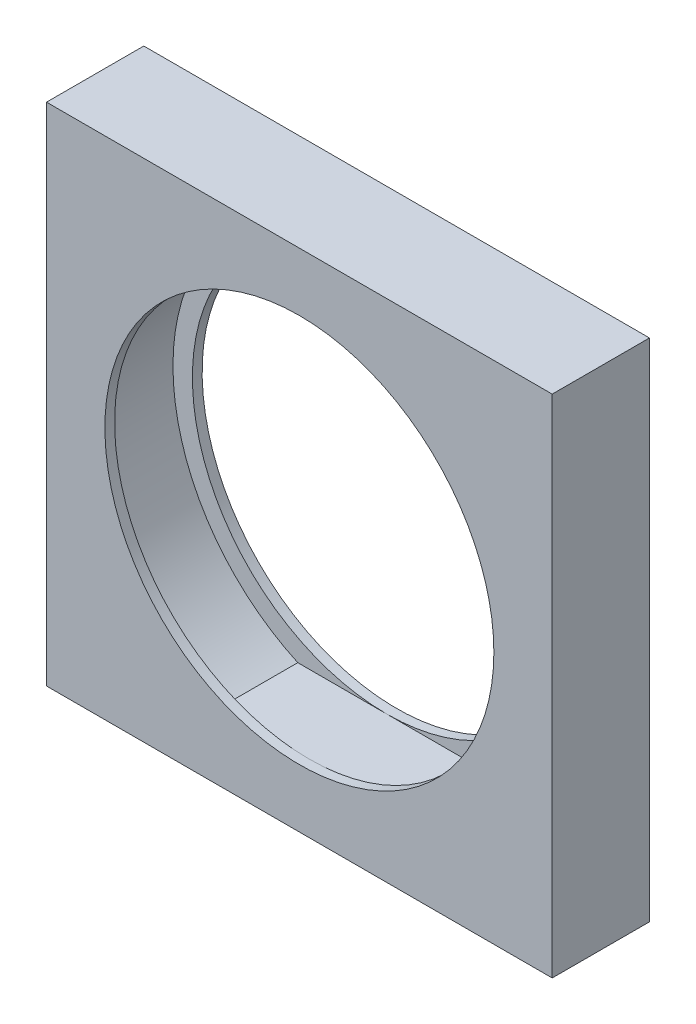
ISO-10303-21;
HEADER;
FILE_DESCRIPTION(('STEP AP214'),'2;1');
FILE_NAME('part.step','',(''),(''),'','','');
FILE_SCHEMA(('AUTOMOTIVE_DESIGN { 1 0 10303 214 1 1 1 1 }'));
ENDSEC;
DATA;
#1=APPLICATION_CONTEXT('core data for automotive mechanical design processes');
#2=APPLICATION_PROTOCOL_DEFINITION('international standard','automotive_design',2000,#1);
#3=PRODUCT_CONTEXT('',#1,'mechanical');
#4=PRODUCT('Part','Part','',(#3));
#5=PRODUCT_RELATED_PRODUCT_CATEGORY('part','',(#4));
#6=PRODUCT_DEFINITION_FORMATION('','',#4);
#7=PRODUCT_DEFINITION_CONTEXT('part definition',#1,'design');
#8=PRODUCT_DEFINITION('design','',#6,#7);
#9=PRODUCT_DEFINITION_SHAPE('','',#8);
#10=(LENGTH_UNIT() NAMED_UNIT(*) SI_UNIT(.MILLI.,.METRE.));
#11=(NAMED_UNIT(*) PLANE_ANGLE_UNIT() SI_UNIT($,.RADIAN.));
#12=(NAMED_UNIT(*) SI_UNIT($,.STERADIAN.) SOLID_ANGLE_UNIT());
#13=UNCERTAINTY_MEASURE_WITH_UNIT(LENGTH_MEASURE(1.E-05),#10,'distance_accuracy_value','');
#14=(GEOMETRIC_REPRESENTATION_CONTEXT(3) GLOBAL_UNCERTAINTY_ASSIGNED_CONTEXT((#13)) GLOBAL_UNIT_ASSIGNED_CONTEXT((#10,
#11,#12)) REPRESENTATION_CONTEXT('',''));
#15=CARTESIAN_POINT('',(0.,0.,0.));
#16=DIRECTION('',(0.,0.,1.));
#17=DIRECTION('',(1.,0.,0.));
#18=AXIS2_PLACEMENT_3D('',#15,#16,#17);
#19=CARTESIAN_POINT('',(0.,0.,5.));
#20=DIRECTION('',(0.,0.,-1.));
#21=DIRECTION('',(-1.,0.,0.));
#22=AXIS2_PLACEMENT_3D('',#19,#20,#21);
#23=CYLINDRICAL_SURFACE('',#22,10.);
#24=CARTESIAN_POINT('',(0.,0.,0.5));
#25=DIRECTION('',(0.,0.,-1.));
#26=DIRECTION('',(0.,1.,0.));
#27=AXIS2_PLACEMENT_3D('',#24,#25,#26);
#28=CIRCLE('',#27,10.);
#29=CARTESIAN_POINT('',(0.,10.,0.5));
#30=VERTEX_POINT('',#29);
#31=CARTESIAN_POINT('',(0.,-10.,0.5));
#32=VERTEX_POINT('',#31);
#33=EDGE_CURVE('E12',#30,#32,#28,.T.);
#34=ORIENTED_EDGE('',*,*,#33,.F.);
#35=EDGE_CURVE('E45',#32,#30,#28,.T.);
#36=ORIENTED_EDGE('',*,*,#35,.F.);
#37=EDGE_LOOP('',(#34,#36));
#38=FACE_BOUND('',#37,.T.);
#39=CARTESIAN_POINT('',(0.,0.,0.));
#40=DIRECTION('',(0.,0.,1.));
#41=DIRECTION('',(1.,0.,0.));
#42=AXIS2_PLACEMENT_3D('',#39,#40,#41);
#43=CIRCLE('',#42,10.);
#44=CARTESIAN_POINT('',(10.,0.,0.));
#45=VERTEX_POINT('',#44);
#46=EDGE_CURVE('E160',#45,#45,#43,.T.);
#47=ORIENTED_EDGE('',*,*,#46,.F.);
#48=EDGE_LOOP('',(#47));
#49=FACE_BOUND('',#48,.T.);
#50=ADVANCED_FACE('F41',(#38,#49),#23,.F.);
#51=CARTESIAN_POINT('',(0.,0.,5.));
#52=DIRECTION('',(0.,0.,-1.));
#53=DIRECTION('',(-1.,0.,0.));
#54=AXIS2_PLACEMENT_3D('',#51,#52,#53);
#55=PLANE('',#54);
#56=DIRECTION('',(0.,1.,0.));
#57=VECTOR('',#56,1.);
#58=CARTESIAN_POINT('',(13.,-13.,5.));
#59=LINE('',#58,#57);
#60=CARTESIAN_POINT('',(13.,-13.,5.));
#61=VERTEX_POINT('',#60);
#62=CARTESIAN_POINT('',(13.,13.,5.));
#63=VERTEX_POINT('',#62);
#64=EDGE_CURVE('E167',#61,#63,#59,.T.);
#65=ORIENTED_EDGE('',*,*,#64,.T.);
#66=DIRECTION('',(-1.,0.,0.));
#67=VECTOR('',#66,1.);
#68=CARTESIAN_POINT('',(-13.,13.,5.));
#69=LINE('',#68,#67);
#70=CARTESIAN_POINT('',(-13.,13.,5.));
#71=VERTEX_POINT('',#70);
#72=EDGE_CURVE('E170',#63,#71,#69,.T.);
#73=ORIENTED_EDGE('',*,*,#72,.T.);
#74=DIRECTION('',(0.,-1.,0.));
#75=VECTOR('',#74,1.);
#76=CARTESIAN_POINT('',(-13.,-13.,5.));
#77=LINE('',#76,#75);
#78=CARTESIAN_POINT('',(-13.,-13.,5.));
#79=VERTEX_POINT('',#78);
#80=EDGE_CURVE('E173',#71,#79,#77,.T.);
#81=ORIENTED_EDGE('',*,*,#80,.T.);
#82=DIRECTION('',(1.,0.,0.));
#83=VECTOR('',#82,1.);
#84=CARTESIAN_POINT('',(-13.,-13.,5.));
#85=LINE('',#84,#83);
#86=EDGE_CURVE('E175',#79,#61,#85,.T.);
#87=ORIENTED_EDGE('',*,*,#86,.T.);
#88=EDGE_LOOP('',(#65,#73,#81,#87));
#89=FACE_BOUND('',#88,.T.);
#90=CARTESIAN_POINT('',(0.,0.,5.));
#91=DIRECTION('',(0.,0.,1.));
#92=DIRECTION('',(1.,0.,0.));
#93=AXIS2_PLACEMENT_3D('',#90,#91,#92);
#94=CIRCLE('',#93,10.);
#95=CARTESIAN_POINT('',(10.,0.,5.));
#96=VERTEX_POINT('',#95);
#97=EDGE_CURVE('E161',#96,#96,#94,.T.);
#98=ORIENTED_EDGE('',*,*,#97,.F.);
#99=EDGE_LOOP('',(#98));
#100=FACE_BOUND('',#99,.T.);
#101=ADVANCED_FACE('F213',(#89,#100),#55,.F.);
#102=CARTESIAN_POINT('',(0.,0.,0.));
#103=DIRECTION('',(0.,0.,-1.));
#104=DIRECTION('',(-1.,0.,0.));
#105=AXIS2_PLACEMENT_3D('',#102,#103,#104);
#106=PLANE('',#105);
#107=DIRECTION('',(0.,1.,0.));
#108=VECTOR('',#107,1.);
#109=CARTESIAN_POINT('',(13.,-13.,0.));
#110=LINE('',#109,#108);
#111=CARTESIAN_POINT('',(13.,-13.,0.));
#112=VERTEX_POINT('',#111);
#113=CARTESIAN_POINT('',(13.,13.,0.));
#114=VERTEX_POINT('',#113);
#115=EDGE_CURVE('E164',#112,#114,#110,.T.);
#116=ORIENTED_EDGE('',*,*,#115,.F.);
#117=DIRECTION('',(1.,0.,0.));
#118=VECTOR('',#117,1.);
#119=CARTESIAN_POINT('',(-13.,-13.,0.));
#120=LINE('',#119,#118);
#121=CARTESIAN_POINT('',(-13.,-13.,0.));
#122=VERTEX_POINT('',#121);
#123=EDGE_CURVE('E171',#122,#112,#120,.T.);
#124=ORIENTED_EDGE('',*,*,#123,.F.);
#125=DIRECTION('',(0.,-1.,0.));
#126=VECTOR('',#125,1.);
#127=CARTESIAN_POINT('',(-13.,-13.,0.));
#128=LINE('',#127,#126);
#129=CARTESIAN_POINT('',(-13.,13.,0.));
#130=VERTEX_POINT('',#129);
#131=EDGE_CURVE('E182',#130,#122,#128,.T.);
#132=ORIENTED_EDGE('',*,*,#131,.F.);
#133=DIRECTION('',(-1.,0.,0.));
#134=VECTOR('',#133,1.);
#135=CARTESIAN_POINT('',(-13.,13.,0.));
#136=LINE('',#135,#134);
#137=EDGE_CURVE('E180',#114,#130,#136,.T.);
#138=ORIENTED_EDGE('',*,*,#137,.F.);
#139=EDGE_LOOP('',(#116,#124,#132,#138));
#140=FACE_BOUND('',#139,.T.);
#141=ORIENTED_EDGE('',*,*,#46,.T.);
#142=EDGE_LOOP('',(#141));
#143=FACE_BOUND('',#142,.T.);
#144=ADVANCED_FACE('F218',(#140,#143),#106,.T.);
#145=CARTESIAN_POINT('',(13.,-13.,5.));
#146=DIRECTION('',(-1.,0.,0.));
#147=DIRECTION('',(0.,0.,1.));
#148=AXIS2_PLACEMENT_3D('',#145,#146,#147);
#149=PLANE('',#148);
#150=ORIENTED_EDGE('',*,*,#115,.T.);
#151=DIRECTION('',(0.,0.,-1.));
#152=VECTOR('',#151,1.);
#153=CARTESIAN_POINT('',(13.,13.,5.));
#154=LINE('',#153,#152);
#155=EDGE_CURVE('E193',#63,#114,#154,.T.);
#156=ORIENTED_EDGE('',*,*,#155,.F.);
#157=ORIENTED_EDGE('',*,*,#64,.F.);
#158=DIRECTION('',(0.,0.,-1.));
#159=VECTOR('',#158,1.);
#160=CARTESIAN_POINT('',(13.,-13.,5.));
#161=LINE('',#160,#159);
#162=EDGE_CURVE('E177',#61,#112,#161,.T.);
#163=ORIENTED_EDGE('',*,*,#162,.T.);
#164=EDGE_LOOP('',(#150,#156,#157,#163));
#165=FACE_BOUND('',#164,.T.);
#166=ADVANCED_FACE('F43',(#165),#149,.F.);
#167=CARTESIAN_POINT('',(-13.,13.,5.));
#168=DIRECTION('',(0.,-1.,0.));
#169=DIRECTION('',(0.,0.,-1.));
#170=AXIS2_PLACEMENT_3D('',#167,#168,#169);
#171=PLANE('',#170);
#172=ORIENTED_EDGE('',*,*,#137,.T.);
#173=DIRECTION('',(0.,0.,-1.));
#174=VECTOR('',#173,1.);
#175=CARTESIAN_POINT('',(-13.,13.,5.));
#176=LINE('',#175,#174);
#177=EDGE_CURVE('E190',#71,#130,#176,.T.);
#178=ORIENTED_EDGE('',*,*,#177,.F.);
#179=ORIENTED_EDGE('',*,*,#72,.F.);
#180=ORIENTED_EDGE('',*,*,#155,.T.);
#181=EDGE_LOOP('',(#172,#178,#179,#180));
#182=FACE_BOUND('',#181,.T.);
#183=ADVANCED_FACE('F226',(#182),#171,.F.);
#184=CARTESIAN_POINT('',(-13.,-13.,5.));
#185=DIRECTION('',(1.,0.,0.));
#186=DIRECTION('',(0.,0.,-1.));
#187=AXIS2_PLACEMENT_3D('',#184,#185,#186);
#188=PLANE('',#187);
#189=ORIENTED_EDGE('',*,*,#131,.T.);
#190=DIRECTION('',(0.,0.,-1.));
#191=VECTOR('',#190,1.);
#192=CARTESIAN_POINT('',(-13.,-13.,5.));
#193=LINE('',#192,#191);
#194=EDGE_CURVE('E187',#79,#122,#193,.T.);
#195=ORIENTED_EDGE('',*,*,#194,.F.);
#196=ORIENTED_EDGE('',*,*,#80,.F.);
#197=ORIENTED_EDGE('',*,*,#177,.T.);
#198=EDGE_LOOP('',(#189,#195,#196,#197));
#199=FACE_BOUND('',#198,.T.);
#200=ADVANCED_FACE('F235',(#199),#188,.F.);
#201=CARTESIAN_POINT('',(-13.,-13.,5.));
#202=DIRECTION('',(0.,1.,0.));
#203=DIRECTION('',(0.,0.,1.));
#204=AXIS2_PLACEMENT_3D('',#201,#202,#203);
#205=PLANE('',#204);
#206=ORIENTED_EDGE('',*,*,#123,.T.);
#207=ORIENTED_EDGE('',*,*,#162,.F.);
#208=ORIENTED_EDGE('',*,*,#86,.F.);
#209=ORIENTED_EDGE('',*,*,#194,.T.);
#210=EDGE_LOOP('',(#206,#207,#208,#209));
#211=FACE_BOUND('',#210,.T.);
#212=ADVANCED_FACE('F232',(#211),#205,.F.);
#213=CARTESIAN_POINT('',(0.,0.,4.5));
#214=DIRECTION('',(0.,0.,1.));
#215=DIRECTION('',(1.,0.,0.));
#216=AXIS2_PLACEMENT_3D('',#213,#214,#215);
#217=CIRCLE('',#216,10.);
#218=CARTESIAN_POINT('',(0.,10.,4.5));
#219=VERTEX_POINT('',#218);
#220=CARTESIAN_POINT('',(0.,-10.,4.5));
#221=VERTEX_POINT('',#220);
#222=EDGE_CURVE('E196',#219,#221,#217,.T.);
#223=ORIENTED_EDGE('',*,*,#222,.F.);
#224=EDGE_CURVE('E195',#221,#219,#217,.T.);
#225=ORIENTED_EDGE('',*,*,#224,.F.);
#226=EDGE_LOOP('',(#223,#225));
#227=FACE_BOUND('',#226,.T.);
#228=ORIENTED_EDGE('',*,*,#97,.T.);
#229=EDGE_LOOP('',(#228));
#230=FACE_BOUND('',#229,.T.);
#231=ADVANCED_FACE('F215',(#227,#230),#23,.F.);
#232=CARTESIAN_POINT('',(-15.001,10.,4.5));
#233=DIRECTION('',(0.,1.,0.));
#234=DIRECTION('',(0.,0.,1.));
#235=AXIS2_PLACEMENT_3D('',#232,#233,#234);
#236=PLANE('',#235);
#237=DIRECTION('',(1.,0.,0.));
#238=VECTOR('',#237,1.);
#239=CARTESIAN_POINT('',(-15.001,10.,4.5));
#240=LINE('',#239,#238);
#241=CARTESIAN_POINT('',(-4.58257569495584,10.,4.5));
#242=VERTEX_POINT('',#241);
#243=EDGE_CURVE('E155',#242,#219,#240,.T.);
#244=ORIENTED_EDGE('',*,*,#243,.F.);
#245=DIRECTION('',(0.,0.,-1.));
#246=VECTOR('',#245,1.);
#247=CARTESIAN_POINT('',(-4.58257569495584,10.,5.));
#248=LINE('',#247,#246);
#249=CARTESIAN_POINT('',(-4.58257569495584,10.,0.5));
#250=VERTEX_POINT('',#249);
#251=EDGE_CURVE('E148',#242,#250,#248,.T.);
#252=ORIENTED_EDGE('',*,*,#251,.T.);
#253=DIRECTION('',(1.,0.,0.));
#254=VECTOR('',#253,1.);
#255=CARTESIAN_POINT('',(-15.001,10.,0.5));
#256=LINE('',#255,#254);
#257=EDGE_CURVE('E146',#250,#30,#256,.T.);
#258=ORIENTED_EDGE('',*,*,#257,.T.);
#259=CARTESIAN_POINT('',(4.58257569495584,10.,0.5));
#260=VERTEX_POINT('',#259);
#261=EDGE_CURVE('E152',#30,#260,#256,.T.);
#262=ORIENTED_EDGE('',*,*,#261,.T.);
#263=DIRECTION('',(0.,0.,-1.));
#264=VECTOR('',#263,1.);
#265=CARTESIAN_POINT('',(4.58257569495584,10.,5.));
#266=LINE('',#265,#264);
#267=CARTESIAN_POINT('',(4.58257569495584,10.,4.5));
#268=VERTEX_POINT('',#267);
#269=EDGE_CURVE('E138',#268,#260,#266,.T.);
#270=ORIENTED_EDGE('',*,*,#269,.F.);
#271=EDGE_CURVE('E158',#219,#268,#240,.T.);
#272=ORIENTED_EDGE('',*,*,#271,.F.);
#273=EDGE_LOOP('',(#244,#252,#258,#262,#270,#272));
#274=FACE_BOUND('',#273,.T.);
#275=ADVANCED_FACE('F208',(#274),#236,.F.);
#276=CARTESIAN_POINT('',(-15.001,-10.,0.5));
#277=DIRECTION('',(0.,0.,-1.));
#278=DIRECTION('',(0.,1.,0.));
#279=AXIS2_PLACEMENT_3D('',#276,#277,#278);
#280=PLANE('',#279);
#281=ORIENTED_EDGE('',*,*,#33,.T.);
#282=DIRECTION('',(1.,0.,0.));
#283=VECTOR('',#282,1.);
#284=CARTESIAN_POINT('',(-15.001,-10.,0.5));
#285=LINE('',#284,#283);
#286=CARTESIAN_POINT('',(4.58257569495584,-10.,0.499999999999999));
#287=VERTEX_POINT('',#286);
#288=EDGE_CURVE('E117',#32,#287,#285,.T.);
#289=ORIENTED_EDGE('',*,*,#288,.T.);
#290=CARTESIAN_POINT('',(0.,0.,0.5));
#291=DIRECTION('',(0.,0.,1.));
#292=DIRECTION('',(0.,-1.,0.));
#293=AXIS2_PLACEMENT_3D('',#290,#291,#292);
#294=CIRCLE('',#293,11.);
#295=EDGE_CURVE('E122',#260,#287,#294,.F.);
#296=ORIENTED_EDGE('',*,*,#295,.F.);
#297=ORIENTED_EDGE('',*,*,#261,.F.);
#298=EDGE_LOOP('',(#281,#289,#296,#297));
#299=FACE_BOUND('',#298,.T.);
#300=ADVANCED_FACE('F119',(#299),#280,.F.);
#301=CARTESIAN_POINT('',(-15.001,-10.,4.5));
#302=DIRECTION('',(0.,-1.,0.));
#303=DIRECTION('',(0.,0.,-1.));
#304=AXIS2_PLACEMENT_3D('',#301,#302,#303);
#305=PLANE('',#304);
#306=DIRECTION('',(1.,0.,0.));
#307=VECTOR('',#306,1.);
#308=CARTESIAN_POINT('',(-15.001,-10.,4.5));
#309=LINE('',#308,#307);
#310=CARTESIAN_POINT('',(4.58257569495584,-10.,4.5));
#311=VERTEX_POINT('',#310);
#312=EDGE_CURVE('E130',#221,#311,#309,.T.);
#313=ORIENTED_EDGE('',*,*,#312,.T.);
#314=DIRECTION('',(0.,0.,-1.));
#315=VECTOR('',#314,1.);
#316=CARTESIAN_POINT('',(4.58257569495584,-10.,5.));
#317=LINE('',#316,#315);
#318=EDGE_CURVE('E128',#287,#311,#317,.F.);
#319=ORIENTED_EDGE('',*,*,#318,.F.);
#320=ORIENTED_EDGE('',*,*,#288,.F.);
#321=CARTESIAN_POINT('',(-4.58257569495584,-10.,0.5));
#322=VERTEX_POINT('',#321);
#323=EDGE_CURVE('E56',#322,#32,#285,.T.);
#324=ORIENTED_EDGE('',*,*,#323,.F.);
#325=DIRECTION('',(0.,0.,-1.));
#326=VECTOR('',#325,1.);
#327=CARTESIAN_POINT('',(-4.58257569495584,-10.,5.));
#328=LINE('',#327,#326);
#329=CARTESIAN_POINT('',(-4.58257569495584,-10.,4.5));
#330=VERTEX_POINT('',#329);
#331=EDGE_CURVE('E143',#322,#330,#328,.F.);
#332=ORIENTED_EDGE('',*,*,#331,.T.);
#333=EDGE_CURVE('E64',#330,#221,#309,.T.);
#334=ORIENTED_EDGE('',*,*,#333,.T.);
#335=EDGE_LOOP('',(#313,#319,#320,#324,#332,#334));
#336=FACE_BOUND('',#335,.T.);
#337=ADVANCED_FACE('F129',(#336),#305,.F.);
#338=CARTESIAN_POINT('',(-15.001,-10.,4.5));
#339=DIRECTION('',(0.,0.,1.));
#340=DIRECTION('',(1.,0.,0.));
#341=AXIS2_PLACEMENT_3D('',#338,#339,#340);
#342=PLANE('',#341);
#343=ORIENTED_EDGE('',*,*,#222,.T.);
#344=ORIENTED_EDGE('',*,*,#333,.F.);
#345=CARTESIAN_POINT('',(0.,0.,4.5));
#346=DIRECTION('',(0.,0.,1.));
#347=DIRECTION('',(1.,0.,0.));
#348=AXIS2_PLACEMENT_3D('',#345,#346,#347);
#349=CIRCLE('',#348,11.);
#350=EDGE_CURVE('E150',#330,#242,#349,.F.);
#351=ORIENTED_EDGE('',*,*,#350,.T.);
#352=ORIENTED_EDGE('',*,*,#243,.T.);
#353=EDGE_LOOP('',(#343,#344,#351,#352));
#354=FACE_BOUND('',#353,.T.);
#355=ADVANCED_FACE('F266',(#354),#342,.F.);
#356=ORIENTED_EDGE('',*,*,#35,.T.);
#357=ORIENTED_EDGE('',*,*,#257,.F.);
#358=CARTESIAN_POINT('',(0.,0.,0.5));
#359=DIRECTION('',(0.,0.,-1.));
#360=DIRECTION('',(0.,1.,0.));
#361=AXIS2_PLACEMENT_3D('',#358,#359,#360);
#362=CIRCLE('',#361,11.);
#363=EDGE_CURVE('E145',#250,#322,#362,.F.);
#364=ORIENTED_EDGE('',*,*,#363,.T.);
#365=ORIENTED_EDGE('',*,*,#323,.T.);
#366=EDGE_LOOP('',(#356,#357,#364,#365));
#367=FACE_BOUND('',#366,.T.);
#368=ADVANCED_FACE('F204',(#367),#280,.F.);
#369=ORIENTED_EDGE('',*,*,#224,.T.);
#370=ORIENTED_EDGE('',*,*,#271,.T.);
#371=CARTESIAN_POINT('',(0.,0.,4.5));
#372=DIRECTION('',(0.,0.,-1.));
#373=DIRECTION('',(-1.,0.,0.));
#374=AXIS2_PLACEMENT_3D('',#371,#372,#373);
#375=CIRCLE('',#374,11.);
#376=EDGE_CURVE('E134',#311,#268,#375,.F.);
#377=ORIENTED_EDGE('',*,*,#376,.F.);
#378=ORIENTED_EDGE('',*,*,#312,.F.);
#379=EDGE_LOOP('',(#369,#370,#377,#378));
#380=FACE_BOUND('',#379,.T.);
#381=ADVANCED_FACE('F262',(#380),#342,.F.);
#382=CARTESIAN_POINT('',(0.,0.,5.));
#383=DIRECTION('',(0.,0.,-1.));
#384=DIRECTION('',(-1.,0.,0.));
#385=AXIS2_PLACEMENT_3D('',#382,#383,#384);
#386=CYLINDRICAL_SURFACE('',#385,11.);
#387=ORIENTED_EDGE('',*,*,#251,.F.);
#388=ORIENTED_EDGE('',*,*,#350,.F.);
#389=ORIENTED_EDGE('',*,*,#331,.F.);
#390=ORIENTED_EDGE('',*,*,#363,.F.);
#391=EDGE_LOOP('',(#387,#388,#389,#390));
#392=FACE_BOUND('',#391,.T.);
#393=ADVANCED_FACE('F265',(#392),#386,.F.);
#394=CARTESIAN_POINT('',(0.,0.,5.));
#395=DIRECTION('',(0.,0.,-1.));
#396=DIRECTION('',(-1.,0.,0.));
#397=AXIS2_PLACEMENT_3D('',#394,#395,#396);
#398=CYLINDRICAL_SURFACE('',#397,11.);
#399=ORIENTED_EDGE('',*,*,#376,.T.);
#400=ORIENTED_EDGE('',*,*,#269,.T.);
#401=ORIENTED_EDGE('',*,*,#295,.T.);
#402=ORIENTED_EDGE('',*,*,#318,.T.);
#403=EDGE_LOOP('',(#399,#400,#401,#402));
#404=FACE_BOUND('',#403,.T.);
#405=ADVANCED_FACE('F136',(#404),#398,.F.);
#406=CLOSED_SHELL('',(#50,#101,#144,#166,#183,#200,#212,#231,#275,#300,#337,#355,#368,#381,#393,#405));
#407=MANIFOLD_SOLID_BREP('B2',#406);
#408=ADVANCED_BREP_SHAPE_REPRESENTATION('',(#18,#407),#14);
#409=SHAPE_DEFINITION_REPRESENTATION(#9,#408);
ENDSEC;
END-ISO-10303-21;
